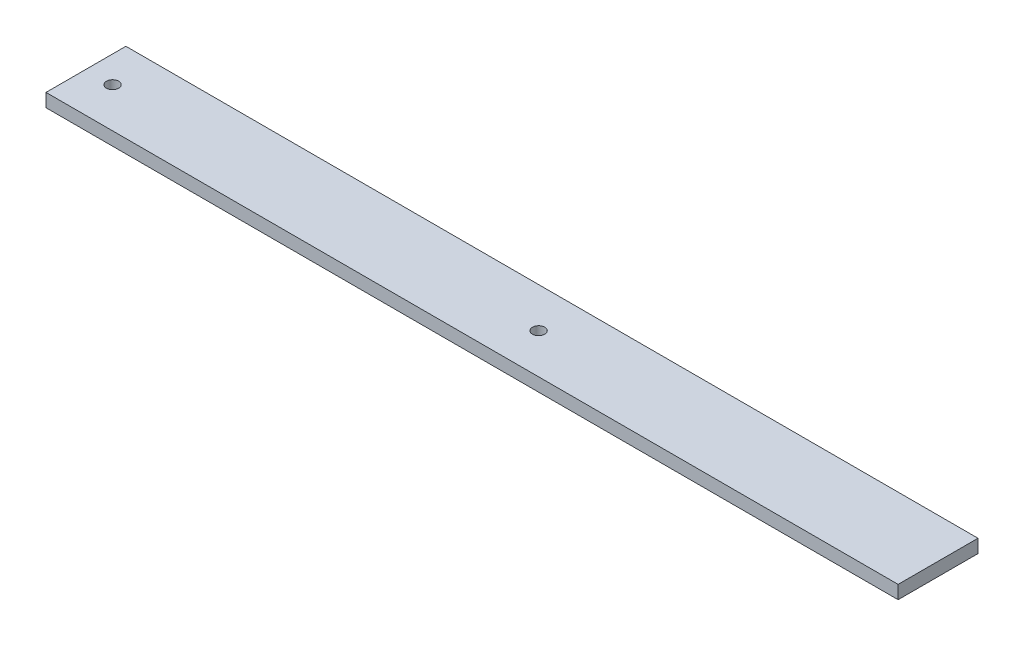
ISO-10303-21;
HEADER;
FILE_DESCRIPTION(('STEP AP214'),'2;1');
FILE_NAME('part.step','',(''),(''),'','','');
FILE_SCHEMA(('AUTOMOTIVE_DESIGN { 1 0 10303 214 1 1 1 1 }'));
ENDSEC;
DATA;
#1=APPLICATION_CONTEXT('core data for automotive mechanical design processes');
#2=APPLICATION_PROTOCOL_DEFINITION('international standard','automotive_design',2000,#1);
#3=PRODUCT_CONTEXT('',#1,'mechanical');
#4=PRODUCT('Part','Part','',(#3));
#5=PRODUCT_RELATED_PRODUCT_CATEGORY('part','',(#4));
#6=PRODUCT_DEFINITION_FORMATION('','',#4);
#7=PRODUCT_DEFINITION_CONTEXT('part definition',#1,'design');
#8=PRODUCT_DEFINITION('design','',#6,#7);
#9=PRODUCT_DEFINITION_SHAPE('','',#8);
#10=(LENGTH_UNIT() NAMED_UNIT(*) SI_UNIT(.MILLI.,.METRE.));
#11=(NAMED_UNIT(*) PLANE_ANGLE_UNIT() SI_UNIT($,.RADIAN.));
#12=(NAMED_UNIT(*) SI_UNIT($,.STERADIAN.) SOLID_ANGLE_UNIT());
#13=UNCERTAINTY_MEASURE_WITH_UNIT(LENGTH_MEASURE(1.E-05),#10,'distance_accuracy_value','');
#14=(GEOMETRIC_REPRESENTATION_CONTEXT(3) GLOBAL_UNCERTAINTY_ASSIGNED_CONTEXT((#13)) GLOBAL_UNIT_ASSIGNED_CONTEXT((#10,
#11,#12)) REPRESENTATION_CONTEXT('',''));
#15=CARTESIAN_POINT('',(0.,0.,0.));
#16=DIRECTION('',(0.,0.,1.));
#17=DIRECTION('',(1.,0.,0.));
#18=AXIS2_PLACEMENT_3D('',#15,#16,#17);
#19=CARTESIAN_POINT('',(0.,3.175,0.));
#20=DIRECTION('',(0.,-1.,0.));
#21=DIRECTION('',(0.,0.,-1.));
#22=AXIS2_PLACEMENT_3D('',#19,#20,#21);
#23=PLANE('',#22);
#24=DIRECTION('',(0.,0.,1.));
#25=VECTOR('',#24,1.);
#26=CARTESIAN_POINT('',(0.,3.175,0.));
#27=LINE('',#26,#25);
#28=CARTESIAN_POINT('',(0.,3.175,-19.05));
#29=VERTEX_POINT('',#28);
#30=CARTESIAN_POINT('',(0.,3.175,0.));
#31=VERTEX_POINT('',#30);
#32=EDGE_CURVE('E91',#29,#31,#27,.T.);
#33=ORIENTED_EDGE('',*,*,#32,.T.);
#34=DIRECTION('',(1.,0.,0.));
#35=VECTOR('',#34,1.);
#36=CARTESIAN_POINT('',(0.,3.175,0.));
#37=LINE('',#36,#35);
#38=CARTESIAN_POINT('',(203.2,3.175,0.));
#39=VERTEX_POINT('',#38);
#40=EDGE_CURVE('E86',#31,#39,#37,.T.);
#41=ORIENTED_EDGE('',*,*,#40,.T.);
#42=DIRECTION('',(0.,0.,-1.));
#43=VECTOR('',#42,1.);
#44=CARTESIAN_POINT('',(203.2,3.175,0.));
#45=LINE('',#44,#43);
#46=CARTESIAN_POINT('',(203.2,3.175,-19.05));
#47=VERTEX_POINT('',#46);
#48=EDGE_CURVE('E89',#39,#47,#45,.T.);
#49=ORIENTED_EDGE('',*,*,#48,.T.);
#50=DIRECTION('',(-1.,0.,0.));
#51=VECTOR('',#50,1.);
#52=CARTESIAN_POINT('',(0.,3.175,-19.05));
#53=LINE('',#52,#51);
#54=EDGE_CURVE('E56',#47,#29,#53,.T.);
#55=ORIENTED_EDGE('',*,*,#54,.T.);
#56=EDGE_LOOP('',(#33,#41,#49,#55));
#57=FACE_BOUND('',#56,.T.);
#58=CARTESIAN_POINT('',(6.35,3.175,-9.525));
#59=DIRECTION('',(0.,1.,0.));
#60=DIRECTION('',(0.,0.,1.));
#61=AXIS2_PLACEMENT_3D('',#58,#59,#60);
#62=CIRCLE('',#61,1.4605);
#63=CARTESIAN_POINT('',(6.35,3.175,-8.0645));
#64=VERTEX_POINT('',#63);
#65=EDGE_CURVE('E106',#64,#64,#62,.T.);
#66=ORIENTED_EDGE('',*,*,#65,.F.);
#67=EDGE_LOOP('',(#66));
#68=FACE_BOUND('',#67,.T.);
#69=CARTESIAN_POINT('',(107.95,3.175,-9.525));
#70=DIRECTION('',(0.,1.,0.));
#71=DIRECTION('',(0.,0.,1.));
#72=AXIS2_PLACEMENT_3D('',#69,#70,#71);
#73=CIRCLE('',#72,1.4605);
#74=CARTESIAN_POINT('',(107.95,3.175,-8.0645));
#75=VERTEX_POINT('',#74);
#76=EDGE_CURVE('E121',#75,#75,#73,.T.);
#77=ORIENTED_EDGE('',*,*,#76,.F.);
#78=EDGE_LOOP('',(#77));
#79=FACE_BOUND('',#78,.T.);
#80=ADVANCED_FACE('F39',(#57,#68,#79),#23,.F.);
#81=CARTESIAN_POINT('',(0.,0.,0.));
#82=DIRECTION('',(0.,-1.,0.));
#83=DIRECTION('',(0.,0.,-1.));
#84=AXIS2_PLACEMENT_3D('',#81,#82,#83);
#85=PLANE('',#84);
#86=CARTESIAN_POINT('',(6.35,0.,-9.525));
#87=DIRECTION('',(0.,1.,0.));
#88=DIRECTION('',(0.,0.,1.));
#89=AXIS2_PLACEMENT_3D('',#86,#87,#88);
#90=CIRCLE('',#89,1.4605);
#91=CARTESIAN_POINT('',(6.35,0.,-8.0645));
#92=VERTEX_POINT('',#91);
#93=EDGE_CURVE('E118',#92,#92,#90,.T.);
#94=ORIENTED_EDGE('',*,*,#93,.T.);
#95=EDGE_LOOP('',(#94));
#96=FACE_BOUND('',#95,.T.);
#97=DIRECTION('',(0.,0.,1.));
#98=VECTOR('',#97,1.);
#99=CARTESIAN_POINT('',(0.,0.,0.));
#100=LINE('',#99,#98);
#101=CARTESIAN_POINT('',(0.,0.,-19.05));
#102=VERTEX_POINT('',#101);
#103=CARTESIAN_POINT('',(0.,0.,0.));
#104=VERTEX_POINT('',#103);
#105=EDGE_CURVE('E103',#102,#104,#100,.T.);
#106=ORIENTED_EDGE('',*,*,#105,.F.);
#107=DIRECTION('',(-1.,0.,0.));
#108=VECTOR('',#107,1.);
#109=CARTESIAN_POINT('',(0.,0.,-19.05));
#110=LINE('',#109,#108);
#111=CARTESIAN_POINT('',(203.2,0.,-19.05));
#112=VERTEX_POINT('',#111);
#113=EDGE_CURVE('E79',#112,#102,#110,.T.);
#114=ORIENTED_EDGE('',*,*,#113,.F.);
#115=DIRECTION('',(0.,0.,-1.));
#116=VECTOR('',#115,1.);
#117=CARTESIAN_POINT('',(203.2,0.,0.));
#118=LINE('',#117,#116);
#119=CARTESIAN_POINT('',(203.2,0.,0.));
#120=VERTEX_POINT('',#119);
#121=EDGE_CURVE('E73',#120,#112,#118,.T.);
#122=ORIENTED_EDGE('',*,*,#121,.F.);
#123=DIRECTION('',(1.,0.,0.));
#124=VECTOR('',#123,1.);
#125=CARTESIAN_POINT('',(0.,0.,0.));
#126=LINE('',#125,#124);
#127=EDGE_CURVE('E95',#104,#120,#126,.T.);
#128=ORIENTED_EDGE('',*,*,#127,.F.);
#129=EDGE_LOOP('',(#106,#114,#122,#128));
#130=FACE_BOUND('',#129,.T.);
#131=CARTESIAN_POINT('',(107.95,0.,-9.525));
#132=DIRECTION('',(0.,1.,0.));
#133=DIRECTION('',(0.,0.,1.));
#134=AXIS2_PLACEMENT_3D('',#131,#132,#133);
#135=CIRCLE('',#134,1.4605);
#136=CARTESIAN_POINT('',(107.95,0.,-8.0645));
#137=VERTEX_POINT('',#136);
#138=EDGE_CURVE('E124',#137,#137,#135,.T.);
#139=ORIENTED_EDGE('',*,*,#138,.T.);
#140=EDGE_LOOP('',(#139));
#141=FACE_BOUND('',#140,.T.);
#142=ADVANCED_FACE('F114',(#96,#130,#141),#85,.T.);
#143=CARTESIAN_POINT('',(0.,3.175,0.));
#144=DIRECTION('',(1.,0.,0.));
#145=DIRECTION('',(0.,0.,-1.));
#146=AXIS2_PLACEMENT_3D('',#143,#144,#145);
#147=PLANE('',#146);
#148=ORIENTED_EDGE('',*,*,#105,.T.);
#149=DIRECTION('',(0.,-1.,0.));
#150=VECTOR('',#149,1.);
#151=CARTESIAN_POINT('',(0.,3.175,0.));
#152=LINE('',#151,#150);
#153=EDGE_CURVE('E11',#31,#104,#152,.T.);
#154=ORIENTED_EDGE('',*,*,#153,.F.);
#155=ORIENTED_EDGE('',*,*,#32,.F.);
#156=DIRECTION('',(0.,-1.,0.));
#157=VECTOR('',#156,1.);
#158=CARTESIAN_POINT('',(0.,3.175,-19.05));
#159=LINE('',#158,#157);
#160=EDGE_CURVE('E99',#29,#102,#159,.T.);
#161=ORIENTED_EDGE('',*,*,#160,.T.);
#162=EDGE_LOOP('',(#148,#154,#155,#161));
#163=FACE_BOUND('',#162,.T.);
#164=ADVANCED_FACE('F41',(#163),#147,.F.);
#165=CARTESIAN_POINT('',(0.,3.175,0.));
#166=DIRECTION('',(0.,0.,-1.));
#167=DIRECTION('',(-1.,0.,0.));
#168=AXIS2_PLACEMENT_3D('',#165,#166,#167);
#169=PLANE('',#168);
#170=ORIENTED_EDGE('',*,*,#127,.T.);
#171=DIRECTION('',(0.,-1.,0.));
#172=VECTOR('',#171,1.);
#173=CARTESIAN_POINT('',(203.2,3.175,0.));
#174=LINE('',#173,#172);
#175=EDGE_CURVE('E48',#39,#120,#174,.T.);
#176=ORIENTED_EDGE('',*,*,#175,.F.);
#177=ORIENTED_EDGE('',*,*,#40,.F.);
#178=ORIENTED_EDGE('',*,*,#153,.T.);
#179=EDGE_LOOP('',(#170,#176,#177,#178));
#180=FACE_BOUND('',#179,.T.);
#181=ADVANCED_FACE('F94',(#180),#169,.F.);
#182=CARTESIAN_POINT('',(203.2,3.175,0.));
#183=DIRECTION('',(-1.,0.,0.));
#184=DIRECTION('',(0.,0.,1.));
#185=AXIS2_PLACEMENT_3D('',#182,#183,#184);
#186=PLANE('',#185);
#187=ORIENTED_EDGE('',*,*,#121,.T.);
#188=DIRECTION('',(0.,-1.,0.));
#189=VECTOR('',#188,1.);
#190=CARTESIAN_POINT('',(203.2,3.175,-19.05));
#191=LINE('',#190,#189);
#192=EDGE_CURVE('E96',#47,#112,#191,.T.);
#193=ORIENTED_EDGE('',*,*,#192,.F.);
#194=ORIENTED_EDGE('',*,*,#48,.F.);
#195=ORIENTED_EDGE('',*,*,#175,.T.);
#196=EDGE_LOOP('',(#187,#193,#194,#195));
#197=FACE_BOUND('',#196,.T.);
#198=ADVANCED_FACE('F97',(#197),#186,.F.);
#199=CARTESIAN_POINT('',(0.,3.175,-19.05));
#200=DIRECTION('',(0.,0.,1.));
#201=DIRECTION('',(1.,0.,0.));
#202=AXIS2_PLACEMENT_3D('',#199,#200,#201);
#203=PLANE('',#202);
#204=ORIENTED_EDGE('',*,*,#113,.T.);
#205=ORIENTED_EDGE('',*,*,#160,.F.);
#206=ORIENTED_EDGE('',*,*,#54,.F.);
#207=ORIENTED_EDGE('',*,*,#192,.T.);
#208=EDGE_LOOP('',(#204,#205,#206,#207));
#209=FACE_BOUND('',#208,.T.);
#210=ADVANCED_FACE('F111',(#209),#203,.F.);
#211=CARTESIAN_POINT('',(6.35,3.175,-9.525));
#212=DIRECTION('',(0.,-1.,0.));
#213=DIRECTION('',(0.,0.,-1.));
#214=AXIS2_PLACEMENT_3D('',#211,#212,#213);
#215=CYLINDRICAL_SURFACE('',#214,1.4605);
#216=ORIENTED_EDGE('',*,*,#65,.T.);
#217=EDGE_LOOP('',(#216));
#218=FACE_BOUND('',#217,.T.);
#219=ORIENTED_EDGE('',*,*,#93,.F.);
#220=EDGE_LOOP('',(#219));
#221=FACE_BOUND('',#220,.T.);
#222=ADVANCED_FACE('F141',(#218,#221),#215,.F.);
#223=CARTESIAN_POINT('',(107.95,3.175,-9.525));
#224=DIRECTION('',(0.,-1.,0.));
#225=DIRECTION('',(0.,0.,-1.));
#226=AXIS2_PLACEMENT_3D('',#223,#224,#225);
#227=CYLINDRICAL_SURFACE('',#226,1.4605);
#228=ORIENTED_EDGE('',*,*,#76,.T.);
#229=EDGE_LOOP('',(#228));
#230=FACE_BOUND('',#229,.T.);
#231=ORIENTED_EDGE('',*,*,#138,.F.);
#232=EDGE_LOOP('',(#231));
#233=FACE_BOUND('',#232,.T.);
#234=ADVANCED_FACE('F130',(#230,#233),#227,.F.);
#235=CLOSED_SHELL('',(#80,#142,#164,#181,#198,#210,#222,#234));
#236=MANIFOLD_SOLID_BREP('B2',#235);
#237=ADVANCED_BREP_SHAPE_REPRESENTATION('',(#18,#236),#14);
#238=SHAPE_DEFINITION_REPRESENTATION(#9,#237);
ENDSEC;
END-ISO-10303-21;
